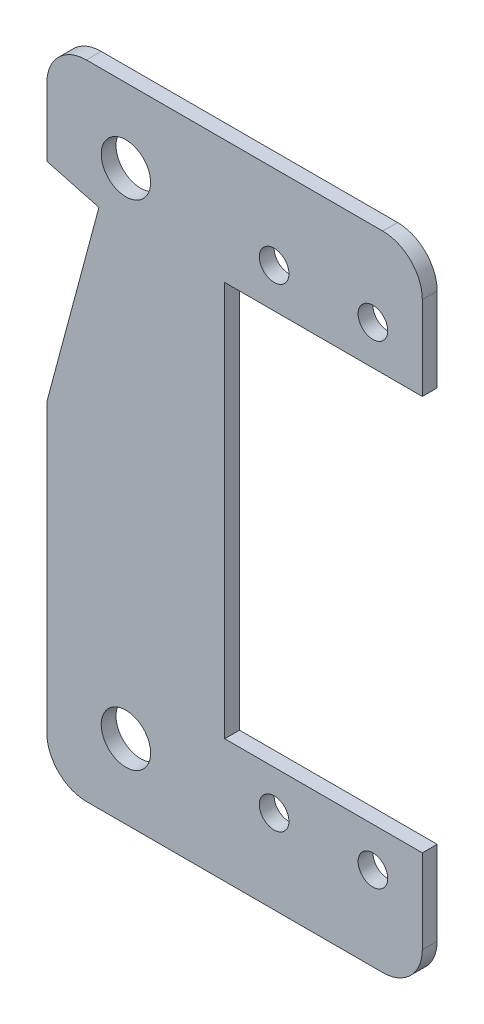
ISO-10303-21;
HEADER;
FILE_DESCRIPTION(('STEP AP214'),'2;1');
FILE_NAME('part.step','',(''),(''),'','','');
FILE_SCHEMA(('AUTOMOTIVE_DESIGN { 1 0 10303 214 1 1 1 1 }'));
ENDSEC;
DATA;
#1=APPLICATION_CONTEXT('core data for automotive mechanical design processes');
#2=APPLICATION_PROTOCOL_DEFINITION('international standard','automotive_design',2000,#1);
#3=PRODUCT_CONTEXT('',#1,'mechanical');
#4=PRODUCT('Part','Part','',(#3));
#5=PRODUCT_RELATED_PRODUCT_CATEGORY('part','',(#4));
#6=PRODUCT_DEFINITION_FORMATION('','',#4);
#7=PRODUCT_DEFINITION_CONTEXT('part definition',#1,'design');
#8=PRODUCT_DEFINITION('design','',#6,#7);
#9=PRODUCT_DEFINITION_SHAPE('','',#8);
#10=(LENGTH_UNIT() NAMED_UNIT(*) SI_UNIT(.MILLI.,.METRE.));
#11=(NAMED_UNIT(*) PLANE_ANGLE_UNIT() SI_UNIT($,.RADIAN.));
#12=(NAMED_UNIT(*) SI_UNIT($,.STERADIAN.) SOLID_ANGLE_UNIT());
#13=UNCERTAINTY_MEASURE_WITH_UNIT(LENGTH_MEASURE(1.E-05),#10,'distance_accuracy_value','');
#14=(GEOMETRIC_REPRESENTATION_CONTEXT(3) GLOBAL_UNCERTAINTY_ASSIGNED_CONTEXT((#13)) GLOBAL_UNIT_ASSIGNED_CONTEXT((#10,
#11,#12)) REPRESENTATION_CONTEXT('',''));
#15=CARTESIAN_POINT('',(0.,0.,0.));
#16=DIRECTION('',(0.,0.,1.));
#17=DIRECTION('',(1.,0.,0.));
#18=AXIS2_PLACEMENT_3D('',#15,#16,#17);
#19=CARTESIAN_POINT('',(0.,32.5,1.5));
#20=DIRECTION('',(1.,0.,0.));
#21=DIRECTION('',(0.,0.,-1.));
#22=AXIS2_PLACEMENT_3D('',#19,#20,#21);
#23=PLANE('',#22);
#24=DIRECTION('',(0.,-1.,0.));
#25=VECTOR('',#24,1.);
#26=CARTESIAN_POINT('',(0.,32.5,0.));
#27=LINE('',#26,#25);
#28=CARTESIAN_POINT('',(0.,28.5,0.));
#29=VERTEX_POINT('',#28);
#30=CARTESIAN_POINT('',(0.,21.617026008757,0.));
#31=VERTEX_POINT('',#30);
#32=EDGE_CURVE('E241',#29,#31,#27,.T.);
#33=ORIENTED_EDGE('',*,*,#32,.T.);
#34=DIRECTION('',(0.,0.,1.));
#35=VECTOR('',#34,1.);
#36=CARTESIAN_POINT('',(0.,21.617026008757,0.));
#37=LINE('',#36,#35);
#38=CARTESIAN_POINT('',(0.,21.617026008757,1.5));
#39=VERTEX_POINT('',#38);
#40=EDGE_CURVE('E146',#31,#39,#37,.T.);
#41=ORIENTED_EDGE('',*,*,#40,.T.);
#42=DIRECTION('',(0.,-1.,0.));
#43=VECTOR('',#42,1.);
#44=CARTESIAN_POINT('',(0.,32.5,1.5));
#45=LINE('',#44,#43);
#46=CARTESIAN_POINT('',(0.,28.5,1.5));
#47=VERTEX_POINT('',#46);
#48=EDGE_CURVE('E221',#47,#39,#45,.T.);
#49=ORIENTED_EDGE('',*,*,#48,.F.);
#50=DIRECTION('',(0.,0.,-1.));
#51=VECTOR('',#50,1.);
#52=CARTESIAN_POINT('',(0.,28.5,1.5));
#53=LINE('',#52,#51);
#54=EDGE_CURVE('E271',#47,#29,#53,.T.);
#55=ORIENTED_EDGE('',*,*,#54,.T.);
#56=EDGE_LOOP('',(#33,#41,#49,#55));
#57=FACE_BOUND('',#56,.T.);
#58=ADVANCED_FACE('F34',(#57),#23,.F.);
#59=CARTESIAN_POINT('',(0.,0.,1.5));
#60=DIRECTION('',(0.,0.,1.));
#61=DIRECTION('',(1.,0.,0.));
#62=AXIS2_PLACEMENT_3D('',#59,#60,#61);
#63=PLANE('',#62);
#64=DIRECTION('',(-0.965925826289068,0.258819045102521,0.));
#65=VECTOR('',#64,1.);
#66=CARTESIAN_POINT('',(0.,21.617026008757,1.5));
#67=LINE('',#66,#65);
#68=CARTESIAN_POINT('',(5.2683321907552,20.2053806527852,1.5));
#69=VERTEX_POINT('',#68);
#70=EDGE_CURVE('E162',#69,#39,#67,.T.);
#71=ORIENTED_EDGE('',*,*,#70,.F.);
#72=DIRECTION('',(0.258819045102521,0.965925826289068,0.));
#73=VECTOR('',#72,1.);
#74=CARTESIAN_POINT('',(5.2683321907552,20.2053806527852,1.5));
#75=LINE('',#74,#73);
#76=CARTESIAN_POINT('',(0.,0.543697245736226,1.5));
#77=VERTEX_POINT('',#76);
#78=EDGE_CURVE('E143',#77,#69,#75,.T.);
#79=ORIENTED_EDGE('',*,*,#78,.F.);
#80=CARTESIAN_POINT('',(0.,-28.5,1.5));
#81=VERTEX_POINT('',#80);
#82=EDGE_CURVE('E220',#77,#81,#45,.T.);
#83=ORIENTED_EDGE('',*,*,#82,.T.);
#84=CARTESIAN_POINT('',(4.,-28.5,1.5));
#85=DIRECTION('',(0.,0.,1.));
#86=DIRECTION('',(1.,0.,0.));
#87=AXIS2_PLACEMENT_3D('',#84,#85,#86);
#88=CIRCLE('',#87,4.);
#89=CARTESIAN_POINT('',(4.,-32.5,1.5));
#90=VERTEX_POINT('',#89);
#91=EDGE_CURVE('E282',#81,#90,#88,.T.);
#92=ORIENTED_EDGE('',*,*,#91,.T.);
#93=DIRECTION('',(1.,0.,0.));
#94=VECTOR('',#93,1.);
#95=CARTESIAN_POINT('',(38.,-32.5,1.5));
#96=LINE('',#95,#94);
#97=CARTESIAN_POINT('',(34.,-32.5,1.5));
#98=VERTEX_POINT('',#97);
#99=EDGE_CURVE('E224',#90,#98,#96,.T.);
#100=ORIENTED_EDGE('',*,*,#99,.T.);
#101=CARTESIAN_POINT('',(34.,-28.5,1.5));
#102=DIRECTION('',(0.,0.,1.));
#103=DIRECTION('',(1.,0.,0.));
#104=AXIS2_PLACEMENT_3D('',#101,#102,#103);
#105=CIRCLE('',#104,4.);
#106=CARTESIAN_POINT('',(38.,-28.5,1.5));
#107=VERTEX_POINT('',#106);
#108=EDGE_CURVE('E57',#98,#107,#105,.T.);
#109=ORIENTED_EDGE('',*,*,#108,.T.);
#110=DIRECTION('',(0.,1.,0.));
#111=VECTOR('',#110,1.);
#112=CARTESIAN_POINT('',(38.,-20.,1.5));
#113=LINE('',#112,#111);
#114=CARTESIAN_POINT('',(38.,-20.,1.5));
#115=VERTEX_POINT('',#114);
#116=EDGE_CURVE('E226',#107,#115,#113,.T.);
#117=ORIENTED_EDGE('',*,*,#116,.T.);
#118=DIRECTION('',(-1.,0.,0.));
#119=VECTOR('',#118,1.);
#120=CARTESIAN_POINT('',(38.,-20.,1.5));
#121=LINE('',#120,#119);
#122=CARTESIAN_POINT('',(18.,-20.,1.5));
#123=VERTEX_POINT('',#122);
#124=EDGE_CURVE('E206',#115,#123,#121,.T.);
#125=ORIENTED_EDGE('',*,*,#124,.T.);
#126=DIRECTION('',(0.,1.,0.));
#127=VECTOR('',#126,1.);
#128=CARTESIAN_POINT('',(18.,20.,1.5));
#129=LINE('',#128,#127);
#130=CARTESIAN_POINT('',(18.,20.,1.5));
#131=VERTEX_POINT('',#130);
#132=EDGE_CURVE('E209',#123,#131,#129,.T.);
#133=ORIENTED_EDGE('',*,*,#132,.T.);
#134=DIRECTION('',(1.,0.,0.));
#135=VECTOR('',#134,1.);
#136=CARTESIAN_POINT('',(38.,20.,1.5));
#137=LINE('',#136,#135);
#138=CARTESIAN_POINT('',(38.,20.,1.5));
#139=VERTEX_POINT('',#138);
#140=EDGE_CURVE('E212',#131,#139,#137,.T.);
#141=ORIENTED_EDGE('',*,*,#140,.T.);
#142=DIRECTION('',(0.,1.,0.));
#143=VECTOR('',#142,1.);
#144=CARTESIAN_POINT('',(38.,32.5,1.5));
#145=LINE('',#144,#143);
#146=CARTESIAN_POINT('',(38.,28.5,1.5));
#147=VERTEX_POINT('',#146);
#148=EDGE_CURVE('E214',#139,#147,#145,.T.);
#149=ORIENTED_EDGE('',*,*,#148,.T.);
#150=CARTESIAN_POINT('',(34.,28.5,1.5));
#151=DIRECTION('',(0.,0.,1.));
#152=DIRECTION('',(1.,0.,0.));
#153=AXIS2_PLACEMENT_3D('',#150,#151,#152);
#154=CIRCLE('',#153,4.);
#155=CARTESIAN_POINT('',(34.,32.5,1.5));
#156=VERTEX_POINT('',#155);
#157=EDGE_CURVE('E277',#147,#156,#154,.T.);
#158=ORIENTED_EDGE('',*,*,#157,.T.);
#159=DIRECTION('',(-1.,0.,0.));
#160=VECTOR('',#159,1.);
#161=CARTESIAN_POINT('',(38.,32.5,1.5));
#162=LINE('',#161,#160);
#163=CARTESIAN_POINT('',(4.,32.5,1.5));
#164=VERTEX_POINT('',#163);
#165=EDGE_CURVE('E217',#156,#164,#162,.T.);
#166=ORIENTED_EDGE('',*,*,#165,.T.);
#167=CARTESIAN_POINT('',(4.00000000000001,28.5,1.5));
#168=DIRECTION('',(0.,0.,1.));
#169=DIRECTION('',(1.,0.,0.));
#170=AXIS2_PLACEMENT_3D('',#167,#168,#169);
#171=CIRCLE('',#170,4.);
#172=EDGE_CURVE('E279',#164,#47,#171,.T.);
#173=ORIENTED_EDGE('',*,*,#172,.T.);
#174=ORIENTED_EDGE('',*,*,#48,.T.);
#175=EDGE_LOOP('',(#71,#79,#83,#92,#100,#109,#117,#125,#133,#141,#149,#158,#166,#173,#174));
#176=FACE_BOUND('',#175,.T.);
#177=CARTESIAN_POINT('',(23.,-24.,1.5));
#178=DIRECTION('',(0.,0.,1.));
#179=DIRECTION('',(-1.,0.,0.));
#180=AXIS2_PLACEMENT_3D('',#177,#178,#179);
#181=CIRCLE('',#180,1.5);
#182=CARTESIAN_POINT('',(21.5,-24.,1.5));
#183=VERTEX_POINT('',#182);
#184=EDGE_CURVE('E176',#183,#183,#181,.T.);
#185=ORIENTED_EDGE('',*,*,#184,.F.);
#186=EDGE_LOOP('',(#185));
#187=FACE_BOUND('',#186,.T.);
#188=CARTESIAN_POINT('',(33.,24.,1.5));
#189=DIRECTION('',(0.,0.,1.));
#190=DIRECTION('',(-1.,0.,0.));
#191=AXIS2_PLACEMENT_3D('',#188,#189,#190);
#192=CIRCLE('',#191,1.5);
#193=CARTESIAN_POINT('',(31.5,24.,1.5));
#194=VERTEX_POINT('',#193);
#195=EDGE_CURVE('E188',#194,#194,#192,.T.);
#196=ORIENTED_EDGE('',*,*,#195,.F.);
#197=EDGE_LOOP('',(#196));
#198=FACE_BOUND('',#197,.T.);
#199=CARTESIAN_POINT('',(8.,25.,1.5));
#200=DIRECTION('',(0.,0.,1.));
#201=DIRECTION('',(1.,0.,0.));
#202=AXIS2_PLACEMENT_3D('',#199,#200,#201);
#203=CIRCLE('',#202,2.5);
#204=CARTESIAN_POINT('',(10.5,25.,1.5));
#205=VERTEX_POINT('',#204);
#206=EDGE_CURVE('E200',#205,#205,#203,.T.);
#207=ORIENTED_EDGE('',*,*,#206,.F.);
#208=EDGE_LOOP('',(#207));
#209=FACE_BOUND('',#208,.T.);
#210=CARTESIAN_POINT('',(23.,24.,1.5));
#211=DIRECTION('',(0.,0.,1.));
#212=DIRECTION('',(1.,0.,0.));
#213=AXIS2_PLACEMENT_3D('',#210,#211,#212);
#214=CIRCLE('',#213,1.5);
#215=CARTESIAN_POINT('',(24.5,24.,1.5));
#216=VERTEX_POINT('',#215);
#217=EDGE_CURVE('E194',#216,#216,#214,.T.);
#218=ORIENTED_EDGE('',*,*,#217,.F.);
#219=EDGE_LOOP('',(#218));
#220=FACE_BOUND('',#219,.T.);
#221=CARTESIAN_POINT('',(33.,-24.,1.5));
#222=DIRECTION('',(0.,0.,1.));
#223=DIRECTION('',(1.,0.,0.));
#224=AXIS2_PLACEMENT_3D('',#221,#222,#223);
#225=CIRCLE('',#224,1.5);
#226=CARTESIAN_POINT('',(34.5,-24.,1.5));
#227=VERTEX_POINT('',#226);
#228=EDGE_CURVE('E182',#227,#227,#225,.T.);
#229=ORIENTED_EDGE('',*,*,#228,.F.);
#230=EDGE_LOOP('',(#229));
#231=FACE_BOUND('',#230,.T.);
#232=CARTESIAN_POINT('',(8.,-25.,1.5));
#233=DIRECTION('',(0.,0.,1.));
#234=DIRECTION('',(-1.,0.,0.));
#235=AXIS2_PLACEMENT_3D('',#232,#233,#234);
#236=CIRCLE('',#235,2.5);
#237=CARTESIAN_POINT('',(5.5,-25.,1.5));
#238=VERTEX_POINT('',#237);
#239=EDGE_CURVE('E170',#238,#238,#236,.T.);
#240=ORIENTED_EDGE('',*,*,#239,.F.);
#241=EDGE_LOOP('',(#240));
#242=FACE_BOUND('',#241,.T.);
#243=ADVANCED_FACE('F297',(#176,#187,#198,#209,#220,#231,#242),#63,.T.);
#244=CARTESIAN_POINT('',(0.,0.,0.));
#245=DIRECTION('',(0.,0.,1.));
#246=DIRECTION('',(1.,0.,0.));
#247=AXIS2_PLACEMENT_3D('',#244,#245,#246);
#248=PLANE('',#247);
#249=CARTESIAN_POINT('',(23.,-24.,0.));
#250=DIRECTION('',(0.,0.,1.));
#251=DIRECTION('',(-1.,0.,0.));
#252=AXIS2_PLACEMENT_3D('',#249,#250,#251);
#253=CIRCLE('',#252,1.5);
#254=CARTESIAN_POINT('',(21.5,-24.,0.));
#255=VERTEX_POINT('',#254);
#256=EDGE_CURVE('E173',#255,#255,#253,.T.);
#257=ORIENTED_EDGE('',*,*,#256,.T.);
#258=EDGE_LOOP('',(#257));
#259=FACE_BOUND('',#258,.T.);
#260=CARTESIAN_POINT('',(33.,24.,0.));
#261=DIRECTION('',(0.,0.,1.));
#262=DIRECTION('',(-1.,0.,0.));
#263=AXIS2_PLACEMENT_3D('',#260,#261,#262);
#264=CIRCLE('',#263,1.5);
#265=CARTESIAN_POINT('',(31.5,24.,0.));
#266=VERTEX_POINT('',#265);
#267=EDGE_CURVE('E185',#266,#266,#264,.T.);
#268=ORIENTED_EDGE('',*,*,#267,.T.);
#269=EDGE_LOOP('',(#268));
#270=FACE_BOUND('',#269,.T.);
#271=CARTESIAN_POINT('',(8.,25.,0.));
#272=DIRECTION('',(0.,0.,1.));
#273=DIRECTION('',(1.,0.,0.));
#274=AXIS2_PLACEMENT_3D('',#271,#272,#273);
#275=CIRCLE('',#274,2.5);
#276=CARTESIAN_POINT('',(10.5,25.,0.));
#277=VERTEX_POINT('',#276);
#278=EDGE_CURVE('E197',#277,#277,#275,.T.);
#279=ORIENTED_EDGE('',*,*,#278,.T.);
#280=EDGE_LOOP('',(#279));
#281=FACE_BOUND('',#280,.T.);
#282=DIRECTION('',(0.258819045102521,0.965925826289068,0.));
#283=VECTOR('',#282,1.);
#284=CARTESIAN_POINT('',(5.2683321907552,20.2053806527852,0.));
#285=LINE('',#284,#283);
#286=CARTESIAN_POINT('',(0.,0.543697245736226,0.));
#287=VERTEX_POINT('',#286);
#288=CARTESIAN_POINT('',(5.2683321907552,20.2053806527852,0.));
#289=VERTEX_POINT('',#288);
#290=EDGE_CURVE('E49',#287,#289,#285,.T.);
#291=ORIENTED_EDGE('',*,*,#290,.T.);
#292=DIRECTION('',(-0.965925826289068,0.258819045102521,0.));
#293=VECTOR('',#292,1.);
#294=CARTESIAN_POINT('',(0.,21.617026008757,0.));
#295=LINE('',#294,#293);
#296=EDGE_CURVE('E150',#289,#31,#295,.T.);
#297=ORIENTED_EDGE('',*,*,#296,.T.);
#298=ORIENTED_EDGE('',*,*,#32,.F.);
#299=CARTESIAN_POINT('',(4.00000000000001,28.5,0.));
#300=DIRECTION('',(0.,0.,1.));
#301=DIRECTION('',(1.,0.,0.));
#302=AXIS2_PLACEMENT_3D('',#299,#300,#301);
#303=CIRCLE('',#302,4.);
#304=CARTESIAN_POINT('',(4.,32.5,0.));
#305=VERTEX_POINT('',#304);
#306=EDGE_CURVE('E265',#29,#305,#303,.F.);
#307=ORIENTED_EDGE('',*,*,#306,.T.);
#308=DIRECTION('',(-1.,0.,0.));
#309=VECTOR('',#308,1.);
#310=CARTESIAN_POINT('',(38.,32.5,0.));
#311=LINE('',#310,#309);
#312=CARTESIAN_POINT('',(34.,32.5,0.));
#313=VERTEX_POINT('',#312);
#314=EDGE_CURVE('E238',#313,#305,#311,.T.);
#315=ORIENTED_EDGE('',*,*,#314,.F.);
#316=CARTESIAN_POINT('',(34.,28.5,0.));
#317=DIRECTION('',(0.,0.,1.));
#318=DIRECTION('',(1.,0.,0.));
#319=AXIS2_PLACEMENT_3D('',#316,#317,#318);
#320=CIRCLE('',#319,4.);
#321=CARTESIAN_POINT('',(38.,28.5,0.));
#322=VERTEX_POINT('',#321);
#323=EDGE_CURVE('E263',#313,#322,#320,.F.);
#324=ORIENTED_EDGE('',*,*,#323,.T.);
#325=DIRECTION('',(0.,1.,0.));
#326=VECTOR('',#325,1.);
#327=CARTESIAN_POINT('',(38.,32.5,0.));
#328=LINE('',#327,#326);
#329=CARTESIAN_POINT('',(38.,20.,0.));
#330=VERTEX_POINT('',#329);
#331=EDGE_CURVE('E235',#330,#322,#328,.T.);
#332=ORIENTED_EDGE('',*,*,#331,.F.);
#333=DIRECTION('',(1.,0.,0.));
#334=VECTOR('',#333,1.);
#335=CARTESIAN_POINT('',(38.,20.,0.));
#336=LINE('',#335,#334);
#337=CARTESIAN_POINT('',(18.,20.,0.));
#338=VERTEX_POINT('',#337);
#339=EDGE_CURVE('E233',#338,#330,#336,.T.);
#340=ORIENTED_EDGE('',*,*,#339,.F.);
#341=DIRECTION('',(0.,1.,0.));
#342=VECTOR('',#341,1.);
#343=CARTESIAN_POINT('',(18.,20.,0.));
#344=LINE('',#343,#342);
#345=CARTESIAN_POINT('',(18.,-20.,0.));
#346=VERTEX_POINT('',#345);
#347=EDGE_CURVE('E231',#346,#338,#344,.T.);
#348=ORIENTED_EDGE('',*,*,#347,.F.);
#349=DIRECTION('',(-1.,0.,0.));
#350=VECTOR('',#349,1.);
#351=CARTESIAN_POINT('',(38.,-20.,0.));
#352=LINE('',#351,#350);
#353=CARTESIAN_POINT('',(38.,-20.,0.));
#354=VERTEX_POINT('',#353);
#355=EDGE_CURVE('E203',#354,#346,#352,.T.);
#356=ORIENTED_EDGE('',*,*,#355,.F.);
#357=DIRECTION('',(0.,1.,0.));
#358=VECTOR('',#357,1.);
#359=CARTESIAN_POINT('',(38.,-20.,0.));
#360=LINE('',#359,#358);
#361=CARTESIAN_POINT('',(38.,-28.5,0.));
#362=VERTEX_POINT('',#361);
#363=EDGE_CURVE('E210',#362,#354,#360,.T.);
#364=ORIENTED_EDGE('',*,*,#363,.F.);
#365=CARTESIAN_POINT('',(34.,-28.5,0.));
#366=DIRECTION('',(0.,0.,1.));
#367=DIRECTION('',(1.,0.,0.));
#368=AXIS2_PLACEMENT_3D('',#365,#366,#367);
#369=CIRCLE('',#368,4.);
#370=CARTESIAN_POINT('',(34.,-32.5,0.));
#371=VERTEX_POINT('',#370);
#372=EDGE_CURVE('E267',#362,#371,#369,.F.);
#373=ORIENTED_EDGE('',*,*,#372,.T.);
#374=DIRECTION('',(1.,0.,0.));
#375=VECTOR('',#374,1.);
#376=CARTESIAN_POINT('',(38.,-32.5,0.));
#377=LINE('',#376,#375);
#378=CARTESIAN_POINT('',(4.,-32.5,0.));
#379=VERTEX_POINT('',#378);
#380=EDGE_CURVE('E243',#379,#371,#377,.T.);
#381=ORIENTED_EDGE('',*,*,#380,.F.);
#382=CARTESIAN_POINT('',(4.,-28.5,0.));
#383=DIRECTION('',(0.,0.,1.));
#384=DIRECTION('',(1.,0.,0.));
#385=AXIS2_PLACEMENT_3D('',#382,#383,#384);
#386=CIRCLE('',#385,4.);
#387=CARTESIAN_POINT('',(0.,-28.5,0.));
#388=VERTEX_POINT('',#387);
#389=EDGE_CURVE('E269',#379,#388,#386,.F.);
#390=ORIENTED_EDGE('',*,*,#389,.T.);
#391=EDGE_CURVE('E161',#287,#388,#27,.T.);
#392=ORIENTED_EDGE('',*,*,#391,.F.);
#393=EDGE_LOOP('',(#291,#297,#298,#307,#315,#324,#332,#340,#348,#356,#364,#373,#381,#390,#392));
#394=FACE_BOUND('',#393,.T.);
#395=CARTESIAN_POINT('',(23.,24.,0.));
#396=DIRECTION('',(0.,0.,1.));
#397=DIRECTION('',(1.,0.,0.));
#398=AXIS2_PLACEMENT_3D('',#395,#396,#397);
#399=CIRCLE('',#398,1.5);
#400=CARTESIAN_POINT('',(24.5,24.,0.));
#401=VERTEX_POINT('',#400);
#402=EDGE_CURVE('E191',#401,#401,#399,.T.);
#403=ORIENTED_EDGE('',*,*,#402,.T.);
#404=EDGE_LOOP('',(#403));
#405=FACE_BOUND('',#404,.T.);
#406=CARTESIAN_POINT('',(33.,-24.,0.));
#407=DIRECTION('',(0.,0.,1.));
#408=DIRECTION('',(1.,0.,0.));
#409=AXIS2_PLACEMENT_3D('',#406,#407,#408);
#410=CIRCLE('',#409,1.5);
#411=CARTESIAN_POINT('',(34.5,-24.,0.));
#412=VERTEX_POINT('',#411);
#413=EDGE_CURVE('E179',#412,#412,#410,.T.);
#414=ORIENTED_EDGE('',*,*,#413,.T.);
#415=EDGE_LOOP('',(#414));
#416=FACE_BOUND('',#415,.T.);
#417=CARTESIAN_POINT('',(8.,-25.,0.));
#418=DIRECTION('',(0.,0.,1.));
#419=DIRECTION('',(-1.,0.,0.));
#420=AXIS2_PLACEMENT_3D('',#417,#418,#419);
#421=CIRCLE('',#420,2.5);
#422=CARTESIAN_POINT('',(5.5,-25.,0.));
#423=VERTEX_POINT('',#422);
#424=EDGE_CURVE('E167',#423,#423,#421,.T.);
#425=ORIENTED_EDGE('',*,*,#424,.T.);
#426=EDGE_LOOP('',(#425));
#427=FACE_BOUND('',#426,.T.);
#428=ADVANCED_FACE('F158',(#259,#270,#281,#394,#405,#416,#427),#248,.F.);
#429=CARTESIAN_POINT('',(38.,-20.,1.5));
#430=DIRECTION('',(0.,-1.,0.));
#431=DIRECTION('',(0.,0.,-1.));
#432=AXIS2_PLACEMENT_3D('',#429,#430,#431);
#433=PLANE('',#432);
#434=ORIENTED_EDGE('',*,*,#355,.T.);
#435=DIRECTION('',(0.,0.,-1.));
#436=VECTOR('',#435,1.);
#437=CARTESIAN_POINT('',(18.,-20.,1.5));
#438=LINE('',#437,#436);
#439=EDGE_CURVE('E255',#123,#346,#438,.T.);
#440=ORIENTED_EDGE('',*,*,#439,.F.);
#441=ORIENTED_EDGE('',*,*,#124,.F.);
#442=DIRECTION('',(0.,0.,-1.));
#443=VECTOR('',#442,1.);
#444=CARTESIAN_POINT('',(38.,-20.,1.5));
#445=LINE('',#444,#443);
#446=EDGE_CURVE('E228',#115,#354,#445,.T.);
#447=ORIENTED_EDGE('',*,*,#446,.T.);
#448=EDGE_LOOP('',(#434,#440,#441,#447));
#449=FACE_BOUND('',#448,.T.);
#450=ADVANCED_FACE('F357',(#449),#433,.F.);
#451=CARTESIAN_POINT('',(18.,20.,1.5));
#452=DIRECTION('',(-1.,0.,0.));
#453=DIRECTION('',(0.,0.,1.));
#454=AXIS2_PLACEMENT_3D('',#451,#452,#453);
#455=PLANE('',#454);
#456=ORIENTED_EDGE('',*,*,#347,.T.);
#457=DIRECTION('',(0.,0.,-1.));
#458=VECTOR('',#457,1.);
#459=CARTESIAN_POINT('',(18.,20.,1.5));
#460=LINE('',#459,#458);
#461=EDGE_CURVE('E252',#131,#338,#460,.T.);
#462=ORIENTED_EDGE('',*,*,#461,.F.);
#463=ORIENTED_EDGE('',*,*,#132,.F.);
#464=ORIENTED_EDGE('',*,*,#439,.T.);
#465=EDGE_LOOP('',(#456,#462,#463,#464));
#466=FACE_BOUND('',#465,.T.);
#467=ADVANCED_FACE('F362',(#466),#455,.F.);
#468=CARTESIAN_POINT('',(38.,20.,1.5));
#469=DIRECTION('',(0.,1.,0.));
#470=DIRECTION('',(0.,0.,1.));
#471=AXIS2_PLACEMENT_3D('',#468,#469,#470);
#472=PLANE('',#471);
#473=ORIENTED_EDGE('',*,*,#339,.T.);
#474=DIRECTION('',(0.,0.,-1.));
#475=VECTOR('',#474,1.);
#476=CARTESIAN_POINT('',(38.,20.,1.5));
#477=LINE('',#476,#475);
#478=EDGE_CURVE('E249',#139,#330,#477,.T.);
#479=ORIENTED_EDGE('',*,*,#478,.F.);
#480=ORIENTED_EDGE('',*,*,#140,.F.);
#481=ORIENTED_EDGE('',*,*,#461,.T.);
#482=EDGE_LOOP('',(#473,#479,#480,#481));
#483=FACE_BOUND('',#482,.T.);
#484=ADVANCED_FACE('F364',(#483),#472,.F.);
#485=CARTESIAN_POINT('',(38.,32.5,1.5));
#486=DIRECTION('',(-1.,0.,0.));
#487=DIRECTION('',(0.,-1.,0.));
#488=AXIS2_PLACEMENT_3D('',#485,#486,#487);
#489=PLANE('',#488);
#490=ORIENTED_EDGE('',*,*,#331,.T.);
#491=DIRECTION('',(0.,0.,-1.));
#492=VECTOR('',#491,1.);
#493=CARTESIAN_POINT('',(38.,28.5,1.5));
#494=LINE('',#493,#492);
#495=EDGE_CURVE('E11',#322,#147,#494,.F.);
#496=ORIENTED_EDGE('',*,*,#495,.T.);
#497=ORIENTED_EDGE('',*,*,#148,.F.);
#498=ORIENTED_EDGE('',*,*,#478,.T.);
#499=EDGE_LOOP('',(#490,#496,#497,#498));
#500=FACE_BOUND('',#499,.T.);
#501=ADVANCED_FACE('F309',(#500),#489,.F.);
#502=CARTESIAN_POINT('',(38.,32.5,1.5));
#503=DIRECTION('',(0.,-1.,0.));
#504=DIRECTION('',(1.,0.,0.));
#505=AXIS2_PLACEMENT_3D('',#502,#503,#504);
#506=PLANE('',#505);
#507=ORIENTED_EDGE('',*,*,#314,.T.);
#508=DIRECTION('',(0.,0.,-1.));
#509=VECTOR('',#508,1.);
#510=CARTESIAN_POINT('',(4.,32.5,1.5));
#511=LINE('',#510,#509);
#512=EDGE_CURVE('E42',#305,#164,#511,.F.);
#513=ORIENTED_EDGE('',*,*,#512,.T.);
#514=ORIENTED_EDGE('',*,*,#165,.F.);
#515=DIRECTION('',(0.,0.,-1.));
#516=VECTOR('',#515,1.);
#517=CARTESIAN_POINT('',(34.,32.5,1.5));
#518=LINE('',#517,#516);
#519=EDGE_CURVE('E287',#156,#313,#518,.T.);
#520=ORIENTED_EDGE('',*,*,#519,.T.);
#521=EDGE_LOOP('',(#507,#513,#514,#520));
#522=FACE_BOUND('',#521,.T.);
#523=ADVANCED_FACE('F292',(#522),#506,.F.);
#524=ORIENTED_EDGE('',*,*,#82,.F.);
#525=DIRECTION('',(0.,0.,1.));
#526=VECTOR('',#525,1.);
#527=CARTESIAN_POINT('',(0.,0.543697245736226,0.));
#528=LINE('',#527,#526);
#529=EDGE_CURVE('E147',#287,#77,#528,.T.);
#530=ORIENTED_EDGE('',*,*,#529,.F.);
#531=ORIENTED_EDGE('',*,*,#391,.T.);
#532=DIRECTION('',(0.,0.,-1.));
#533=VECTOR('',#532,1.);
#534=CARTESIAN_POINT('',(0.,-28.5,1.5));
#535=LINE('',#534,#533);
#536=EDGE_CURVE('E274',#388,#81,#535,.F.);
#537=ORIENTED_EDGE('',*,*,#536,.T.);
#538=EDGE_LOOP('',(#524,#530,#531,#537));
#539=FACE_BOUND('',#538,.T.);
#540=ADVANCED_FACE('F322',(#539),#23,.F.);
#541=CARTESIAN_POINT('',(38.,-32.5,1.5));
#542=DIRECTION('',(0.,1.,0.));
#543=DIRECTION('',(-1.,0.,0.));
#544=AXIS2_PLACEMENT_3D('',#541,#542,#543);
#545=PLANE('',#544);
#546=ORIENTED_EDGE('',*,*,#99,.F.);
#547=DIRECTION('',(0.,0.,-1.));
#548=VECTOR('',#547,1.);
#549=CARTESIAN_POINT('',(4.,-32.5,1.5));
#550=LINE('',#549,#548);
#551=EDGE_CURVE('E260',#90,#379,#550,.T.);
#552=ORIENTED_EDGE('',*,*,#551,.T.);
#553=ORIENTED_EDGE('',*,*,#380,.T.);
#554=DIRECTION('',(0.,0.,-1.));
#555=VECTOR('',#554,1.);
#556=CARTESIAN_POINT('',(34.,-32.5,1.5));
#557=LINE('',#556,#555);
#558=EDGE_CURVE('E258',#371,#98,#557,.F.);
#559=ORIENTED_EDGE('',*,*,#558,.T.);
#560=EDGE_LOOP('',(#546,#552,#553,#559));
#561=FACE_BOUND('',#560,.T.);
#562=ADVANCED_FACE('F330',(#561),#545,.F.);
#563=CARTESIAN_POINT('',(38.,-20.,1.5));
#564=DIRECTION('',(-1.,0.,0.));
#565=DIRECTION('',(0.,-1.,0.));
#566=AXIS2_PLACEMENT_3D('',#563,#564,#565);
#567=PLANE('',#566);
#568=ORIENTED_EDGE('',*,*,#116,.F.);
#569=DIRECTION('',(0.,0.,-1.));
#570=VECTOR('',#569,1.);
#571=CARTESIAN_POINT('',(38.,-28.5,1.5));
#572=LINE('',#571,#570);
#573=EDGE_CURVE('E284',#107,#362,#572,.T.);
#574=ORIENTED_EDGE('',*,*,#573,.T.);
#575=ORIENTED_EDGE('',*,*,#363,.T.);
#576=ORIENTED_EDGE('',*,*,#446,.F.);
#577=EDGE_LOOP('',(#568,#574,#575,#576));
#578=FACE_BOUND('',#577,.T.);
#579=ADVANCED_FACE('F337',(#578),#567,.F.);
#580=CARTESIAN_POINT('',(8.,25.,1.5));
#581=DIRECTION('',(0.,0.,-1.));
#582=DIRECTION('',(-1.,0.,0.));
#583=AXIS2_PLACEMENT_3D('',#580,#581,#582);
#584=CYLINDRICAL_SURFACE('',#583,2.5);
#585=ORIENTED_EDGE('',*,*,#206,.T.);
#586=EDGE_LOOP('',(#585));
#587=FACE_BOUND('',#586,.T.);
#588=ORIENTED_EDGE('',*,*,#278,.F.);
#589=EDGE_LOOP('',(#588));
#590=FACE_BOUND('',#589,.T.);
#591=ADVANCED_FACE('F431',(#587,#590),#584,.F.);
#592=CARTESIAN_POINT('',(23.,24.,1.5));
#593=DIRECTION('',(0.,0.,-1.));
#594=DIRECTION('',(-1.,0.,0.));
#595=AXIS2_PLACEMENT_3D('',#592,#593,#594);
#596=CYLINDRICAL_SURFACE('',#595,1.5);
#597=ORIENTED_EDGE('',*,*,#217,.T.);
#598=EDGE_LOOP('',(#597));
#599=FACE_BOUND('',#598,.T.);
#600=ORIENTED_EDGE('',*,*,#402,.F.);
#601=EDGE_LOOP('',(#600));
#602=FACE_BOUND('',#601,.T.);
#603=ADVANCED_FACE('F427',(#599,#602),#596,.F.);
#604=CARTESIAN_POINT('',(33.,24.,1.5));
#605=DIRECTION('',(0.,0.,-1.));
#606=DIRECTION('',(-1.,0.,0.));
#607=AXIS2_PLACEMENT_3D('',#604,#605,#606);
#608=CYLINDRICAL_SURFACE('',#607,1.5);
#609=ORIENTED_EDGE('',*,*,#195,.T.);
#610=EDGE_LOOP('',(#609));
#611=FACE_BOUND('',#610,.T.);
#612=ORIENTED_EDGE('',*,*,#267,.F.);
#613=EDGE_LOOP('',(#612));
#614=FACE_BOUND('',#613,.T.);
#615=ADVANCED_FACE('F423',(#611,#614),#608,.F.);
#616=CARTESIAN_POINT('',(33.,-24.,1.5));
#617=DIRECTION('',(0.,0.,-1.));
#618=DIRECTION('',(-1.,0.,0.));
#619=AXIS2_PLACEMENT_3D('',#616,#617,#618);
#620=CYLINDRICAL_SURFACE('',#619,1.5);
#621=ORIENTED_EDGE('',*,*,#228,.T.);
#622=EDGE_LOOP('',(#621));
#623=FACE_BOUND('',#622,.T.);
#624=ORIENTED_EDGE('',*,*,#413,.F.);
#625=EDGE_LOOP('',(#624));
#626=FACE_BOUND('',#625,.T.);
#627=ADVANCED_FACE('F419',(#623,#626),#620,.F.);
#628=CARTESIAN_POINT('',(23.,-24.,1.5));
#629=DIRECTION('',(0.,0.,-1.));
#630=DIRECTION('',(-1.,0.,0.));
#631=AXIS2_PLACEMENT_3D('',#628,#629,#630);
#632=CYLINDRICAL_SURFACE('',#631,1.5);
#633=ORIENTED_EDGE('',*,*,#184,.T.);
#634=EDGE_LOOP('',(#633));
#635=FACE_BOUND('',#634,.T.);
#636=ORIENTED_EDGE('',*,*,#256,.F.);
#637=EDGE_LOOP('',(#636));
#638=FACE_BOUND('',#637,.T.);
#639=ADVANCED_FACE('F415',(#635,#638),#632,.F.);
#640=CARTESIAN_POINT('',(8.,-25.,1.5));
#641=DIRECTION('',(0.,0.,-1.));
#642=DIRECTION('',(-1.,0.,0.));
#643=AXIS2_PLACEMENT_3D('',#640,#641,#642);
#644=CYLINDRICAL_SURFACE('',#643,2.5);
#645=ORIENTED_EDGE('',*,*,#239,.T.);
#646=EDGE_LOOP('',(#645));
#647=FACE_BOUND('',#646,.T.);
#648=ORIENTED_EDGE('',*,*,#424,.F.);
#649=EDGE_LOOP('',(#648));
#650=FACE_BOUND('',#649,.T.);
#651=ADVANCED_FACE('F378',(#647,#650),#644,.F.);
#652=CARTESIAN_POINT('',(4.,-28.5,1.5));
#653=DIRECTION('',(0.,0.,-1.));
#654=DIRECTION('',(-1.,0.,0.));
#655=AXIS2_PLACEMENT_3D('',#652,#653,#654);
#656=CYLINDRICAL_SURFACE('',#655,4.);
#657=ORIENTED_EDGE('',*,*,#91,.F.);
#658=ORIENTED_EDGE('',*,*,#536,.F.);
#659=ORIENTED_EDGE('',*,*,#389,.F.);
#660=ORIENTED_EDGE('',*,*,#551,.F.);
#661=EDGE_LOOP('',(#657,#658,#659,#660));
#662=FACE_BOUND('',#661,.T.);
#663=ADVANCED_FACE('F348',(#662),#656,.T.);
#664=CARTESIAN_POINT('',(34.,-28.5,1.5));
#665=DIRECTION('',(0.,0.,-1.));
#666=DIRECTION('',(-1.,0.,0.));
#667=AXIS2_PLACEMENT_3D('',#664,#665,#666);
#668=CYLINDRICAL_SURFACE('',#667,4.);
#669=ORIENTED_EDGE('',*,*,#108,.F.);
#670=ORIENTED_EDGE('',*,*,#558,.F.);
#671=ORIENTED_EDGE('',*,*,#372,.F.);
#672=ORIENTED_EDGE('',*,*,#573,.F.);
#673=EDGE_LOOP('',(#669,#670,#671,#672));
#674=FACE_BOUND('',#673,.T.);
#675=ADVANCED_FACE('F319',(#674),#668,.T.);
#676=CARTESIAN_POINT('',(4.00000000000001,28.5,1.5));
#677=DIRECTION('',(0.,0.,-1.));
#678=DIRECTION('',(-1.,0.,0.));
#679=AXIS2_PLACEMENT_3D('',#676,#677,#678);
#680=CYLINDRICAL_SURFACE('',#679,4.);
#681=ORIENTED_EDGE('',*,*,#172,.F.);
#682=ORIENTED_EDGE('',*,*,#512,.F.);
#683=ORIENTED_EDGE('',*,*,#306,.F.);
#684=ORIENTED_EDGE('',*,*,#54,.F.);
#685=EDGE_LOOP('',(#681,#682,#683,#684));
#686=FACE_BOUND('',#685,.T.);
#687=ADVANCED_FACE('F302',(#686),#680,.T.);
#688=CARTESIAN_POINT('',(34.,28.5,1.5));
#689=DIRECTION('',(0.,0.,-1.));
#690=DIRECTION('',(-1.,0.,0.));
#691=AXIS2_PLACEMENT_3D('',#688,#689,#690);
#692=CYLINDRICAL_SURFACE('',#691,4.);
#693=ORIENTED_EDGE('',*,*,#157,.F.);
#694=ORIENTED_EDGE('',*,*,#495,.F.);
#695=ORIENTED_EDGE('',*,*,#323,.F.);
#696=ORIENTED_EDGE('',*,*,#519,.F.);
#697=EDGE_LOOP('',(#693,#694,#695,#696));
#698=FACE_BOUND('',#697,.T.);
#699=ADVANCED_FACE('F36',(#698),#692,.T.);
#700=CARTESIAN_POINT('',(0.,21.617026008757,0.));
#701=DIRECTION('',(0.258819045102521,0.965925826289068,0.));
#702=DIRECTION('',(-0.965925826289068,0.258819045102521,0.));
#703=AXIS2_PLACEMENT_3D('',#700,#701,#702);
#704=PLANE('',#703);
#705=ORIENTED_EDGE('',*,*,#70,.T.);
#706=ORIENTED_EDGE('',*,*,#40,.F.);
#707=ORIENTED_EDGE('',*,*,#296,.F.);
#708=DIRECTION('',(0.,0.,1.));
#709=VECTOR('',#708,1.);
#710=CARTESIAN_POINT('',(5.2683321907552,20.2053806527852,0.));
#711=LINE('',#710,#709);
#712=EDGE_CURVE('E139',#289,#69,#711,.T.);
#713=ORIENTED_EDGE('',*,*,#712,.T.);
#714=EDGE_LOOP('',(#705,#706,#707,#713));
#715=FACE_BOUND('',#714,.T.);
#716=ADVANCED_FACE('F151',(#715),#704,.F.);
#717=CARTESIAN_POINT('',(5.2683321907552,20.2053806527852,0.));
#718=DIRECTION('',(0.965925826289068,-0.258819045102521,0.));
#719=DIRECTION('',(0.258819045102521,0.965925826289068,0.));
#720=AXIS2_PLACEMENT_3D('',#717,#718,#719);
#721=PLANE('',#720);
#722=ORIENTED_EDGE('',*,*,#78,.T.);
#723=ORIENTED_EDGE('',*,*,#712,.F.);
#724=ORIENTED_EDGE('',*,*,#290,.F.);
#725=ORIENTED_EDGE('',*,*,#529,.T.);
#726=EDGE_LOOP('',(#722,#723,#724,#725));
#727=FACE_BOUND('',#726,.T.);
#728=ADVANCED_FACE('F141',(#727),#721,.F.);
#729=CLOSED_SHELL('',(#58,#243,#428,#450,#467,#484,#501,#523,#540,#562,#579,#591,#603,#615,#627,
#639,#651,#663,#675,#687,#699,#716,#728));
#730=MANIFOLD_SOLID_BREP('B2',#729);
#731=ADVANCED_BREP_SHAPE_REPRESENTATION('',(#18,#730),#14);
#732=SHAPE_DEFINITION_REPRESENTATION(#9,#731);
ENDSEC;
END-ISO-10303-21;
